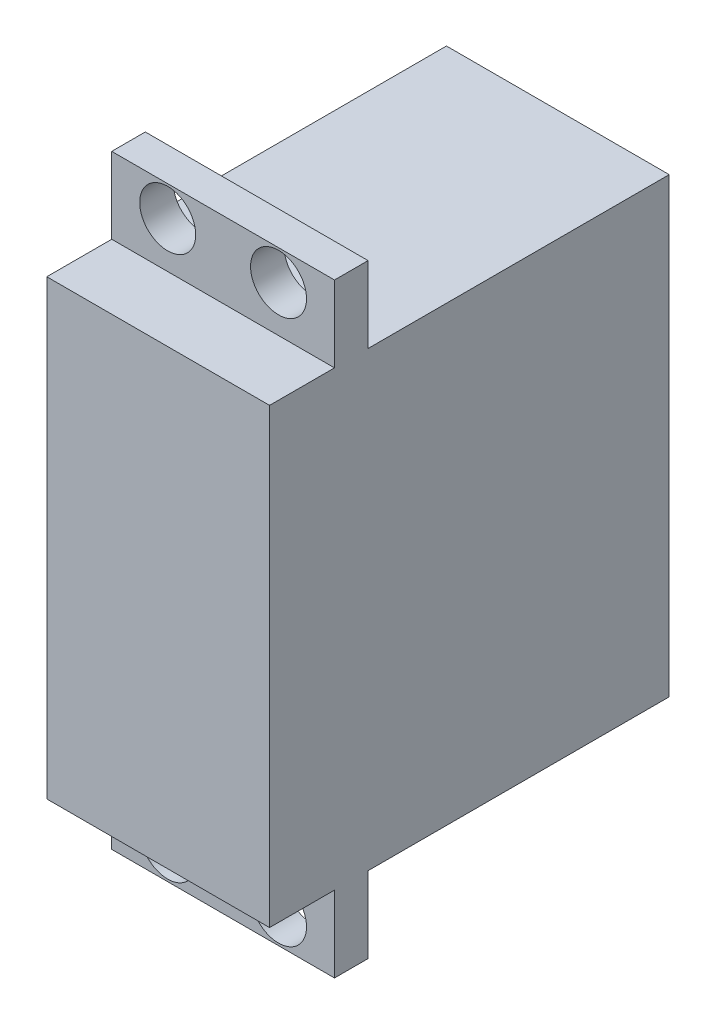
ISO-10303-21;
HEADER;
FILE_DESCRIPTION(('STEP AP214'),'2;1');
FILE_NAME('part.step','',(''),(''),'','','');
FILE_SCHEMA(('AUTOMOTIVE_DESIGN { 1 0 10303 214 1 1 1 1 }'));
ENDSEC;
DATA;
#1=APPLICATION_CONTEXT('core data for automotive mechanical design processes');
#2=APPLICATION_PROTOCOL_DEFINITION('international standard','automotive_design',2000,#1);
#3=PRODUCT_CONTEXT('',#1,'mechanical');
#4=PRODUCT('Part','Part','',(#3));
#5=PRODUCT_RELATED_PRODUCT_CATEGORY('part','',(#4));
#6=PRODUCT_DEFINITION_FORMATION('','',#4);
#7=PRODUCT_DEFINITION_CONTEXT('part definition',#1,'design');
#8=PRODUCT_DEFINITION('design','',#6,#7);
#9=PRODUCT_DEFINITION_SHAPE('','',#8);
#10=(LENGTH_UNIT() NAMED_UNIT(*) SI_UNIT(.MILLI.,.METRE.));
#11=(NAMED_UNIT(*) PLANE_ANGLE_UNIT() SI_UNIT($,.RADIAN.));
#12=(NAMED_UNIT(*) SI_UNIT($,.STERADIAN.) SOLID_ANGLE_UNIT());
#13=UNCERTAINTY_MEASURE_WITH_UNIT(LENGTH_MEASURE(1.E-05),#10,'distance_accuracy_value','');
#14=(GEOMETRIC_REPRESENTATION_CONTEXT(3) GLOBAL_UNCERTAINTY_ASSIGNED_CONTEXT((#13)) GLOBAL_UNIT_ASSIGNED_CONTEXT((#10,
#11,#12)) REPRESENTATION_CONTEXT('',''));
#15=CARTESIAN_POINT('',(0.,0.,0.));
#16=DIRECTION('',(0.,0.,1.));
#17=DIRECTION('',(1.,0.,0.));
#18=AXIS2_PLACEMENT_3D('',#15,#16,#17);
#19=CARTESIAN_POINT('',(-9.95,20.2,17.85));
#20=DIRECTION('',(0.,-1.,0.));
#21=DIRECTION('',(0.,0.,-1.));
#22=AXIS2_PLACEMENT_3D('',#19,#20,#21);
#23=PLANE('',#22);
#24=DIRECTION('',(1.,0.,0.));
#25=VECTOR('',#24,1.);
#26=CARTESIAN_POINT('',(-9.95,20.2,12.05));
#27=LINE('',#26,#25);
#28=CARTESIAN_POINT('',(-9.95,20.2,12.05));
#29=VERTEX_POINT('',#28);
#30=CARTESIAN_POINT('',(9.95,20.2,12.05));
#31=VERTEX_POINT('',#30);
#32=EDGE_CURVE('E178',#29,#31,#27,.T.);
#33=ORIENTED_EDGE('',*,*,#32,.F.);
#34=DIRECTION('',(0.,0.,-1.));
#35=VECTOR('',#34,1.);
#36=CARTESIAN_POINT('',(-9.95,20.2,17.85));
#37=LINE('',#36,#35);
#38=CARTESIAN_POINT('',(-9.95,20.2,17.85));
#39=VERTEX_POINT('',#38);
#40=EDGE_CURVE('E208',#39,#29,#37,.T.);
#41=ORIENTED_EDGE('',*,*,#40,.F.);
#42=DIRECTION('',(-1.,0.,0.));
#43=VECTOR('',#42,1.);
#44=CARTESIAN_POINT('',(-9.95,20.2,17.85));
#45=LINE('',#44,#43);
#46=CARTESIAN_POINT('',(9.95,20.2,17.85));
#47=VERTEX_POINT('',#46);
#48=EDGE_CURVE('E184',#47,#39,#45,.T.);
#49=ORIENTED_EDGE('',*,*,#48,.F.);
#50=DIRECTION('',(0.,0.,-1.));
#51=VECTOR('',#50,1.);
#52=CARTESIAN_POINT('',(9.95,20.2,17.85));
#53=LINE('',#52,#51);
#54=EDGE_CURVE('E212',#47,#31,#53,.T.);
#55=ORIENTED_EDGE('',*,*,#54,.T.);
#56=EDGE_LOOP('',(#33,#41,#49,#55));
#57=FACE_BOUND('',#56,.T.);
#58=ADVANCED_FACE('F37',(#57),#23,.F.);
#59=CARTESIAN_POINT('',(-9.95,-20.2,17.85));
#60=DIRECTION('',(0.,1.,0.));
#61=DIRECTION('',(0.,0.,1.));
#62=AXIS2_PLACEMENT_3D('',#59,#60,#61);
#63=PLANE('',#62);
#64=DIRECTION('',(-1.,0.,0.));
#65=VECTOR('',#64,1.);
#66=CARTESIAN_POINT('',(-9.95,-20.2,12.05));
#67=LINE('',#66,#65);
#68=CARTESIAN_POINT('',(9.95,-20.2,12.05));
#69=VERTEX_POINT('',#68);
#70=CARTESIAN_POINT('',(-9.95,-20.2,12.05));
#71=VERTEX_POINT('',#70);
#72=EDGE_CURVE('E11',#69,#71,#67,.T.);
#73=ORIENTED_EDGE('',*,*,#72,.F.);
#74=DIRECTION('',(0.,0.,-1.));
#75=VECTOR('',#74,1.);
#76=CARTESIAN_POINT('',(9.95,-20.2,17.85));
#77=LINE('',#76,#75);
#78=CARTESIAN_POINT('',(9.95,-20.2,17.85));
#79=VERTEX_POINT('',#78);
#80=EDGE_CURVE('E137',#79,#69,#77,.T.);
#81=ORIENTED_EDGE('',*,*,#80,.F.);
#82=DIRECTION('',(1.,0.,0.));
#83=VECTOR('',#82,1.);
#84=CARTESIAN_POINT('',(-9.95,-20.2,17.85));
#85=LINE('',#84,#83);
#86=CARTESIAN_POINT('',(-9.95,-20.2,17.85));
#87=VERTEX_POINT('',#86);
#88=EDGE_CURVE('E189',#87,#79,#85,.T.);
#89=ORIENTED_EDGE('',*,*,#88,.F.);
#90=DIRECTION('',(0.,0.,-1.));
#91=VECTOR('',#90,1.);
#92=CARTESIAN_POINT('',(-9.95,-20.2,17.85));
#93=LINE('',#92,#91);
#94=EDGE_CURVE('E204',#87,#71,#93,.T.);
#95=ORIENTED_EDGE('',*,*,#94,.T.);
#96=EDGE_LOOP('',(#73,#81,#89,#95));
#97=FACE_BOUND('',#96,.T.);
#98=ADVANCED_FACE('F284',(#97),#63,.F.);
#99=CARTESIAN_POINT('',(9.95,-20.2,17.85));
#100=DIRECTION('',(-1.,0.,0.));
#101=DIRECTION('',(0.,0.,1.));
#102=AXIS2_PLACEMENT_3D('',#99,#100,#101);
#103=PLANE('',#102);
#104=CARTESIAN_POINT('',(9.95,20.2,9.05));
#105=VERTEX_POINT('',#104);
#106=CARTESIAN_POINT('',(9.95,20.2,-17.85));
#107=VERTEX_POINT('',#106);
#108=EDGE_CURVE('E211',#105,#107,#53,.T.);
#109=ORIENTED_EDGE('',*,*,#108,.F.);
#110=DIRECTION('',(0.,-1.,0.));
#111=VECTOR('',#110,1.);
#112=CARTESIAN_POINT('',(9.95,-27.,9.05));
#113=LINE('',#112,#111);
#114=CARTESIAN_POINT('',(9.95,27.,9.05));
#115=VERTEX_POINT('',#114);
#116=EDGE_CURVE('E54',#115,#105,#113,.T.);
#117=ORIENTED_EDGE('',*,*,#116,.F.);
#118=DIRECTION('',(0.,0.,-1.));
#119=VECTOR('',#118,1.);
#120=CARTESIAN_POINT('',(9.95,27.,12.05));
#121=LINE('',#120,#119);
#122=CARTESIAN_POINT('',(9.95,27.,12.05));
#123=VERTEX_POINT('',#122);
#124=EDGE_CURVE('E170',#123,#115,#121,.T.);
#125=ORIENTED_EDGE('',*,*,#124,.F.);
#126=DIRECTION('',(0.,-1.,0.));
#127=VECTOR('',#126,1.);
#128=CARTESIAN_POINT('',(9.95,-27.,12.05));
#129=LINE('',#128,#127);
#130=EDGE_CURVE('E141',#123,#31,#129,.T.);
#131=ORIENTED_EDGE('',*,*,#130,.T.);
#132=ORIENTED_EDGE('',*,*,#54,.F.);
#133=DIRECTION('',(0.,1.,0.));
#134=VECTOR('',#133,1.);
#135=CARTESIAN_POINT('',(9.95,-20.2,17.85));
#136=LINE('',#135,#134);
#137=EDGE_CURVE('E181',#79,#47,#136,.T.);
#138=ORIENTED_EDGE('',*,*,#137,.F.);
#139=ORIENTED_EDGE('',*,*,#80,.T.);
#140=CARTESIAN_POINT('',(9.95,-27.,12.05));
#141=VERTEX_POINT('',#140);
#142=EDGE_CURVE('E129',#69,#141,#129,.T.);
#143=ORIENTED_EDGE('',*,*,#142,.T.);
#144=DIRECTION('',(0.,0.,-1.));
#145=VECTOR('',#144,1.);
#146=CARTESIAN_POINT('',(9.95,-27.,12.05));
#147=LINE('',#146,#145);
#148=CARTESIAN_POINT('',(9.95,-27.,9.05));
#149=VERTEX_POINT('',#148);
#150=EDGE_CURVE('E133',#141,#149,#147,.T.);
#151=ORIENTED_EDGE('',*,*,#150,.T.);
#152=CARTESIAN_POINT('',(9.95,-20.2,9.05));
#153=VERTEX_POINT('',#152);
#154=EDGE_CURVE('E165',#153,#149,#113,.T.);
#155=ORIENTED_EDGE('',*,*,#154,.F.);
#156=CARTESIAN_POINT('',(9.95,-20.2,-17.85));
#157=VERTEX_POINT('',#156);
#158=EDGE_CURVE('E191',#153,#157,#77,.T.);
#159=ORIENTED_EDGE('',*,*,#158,.T.);
#160=DIRECTION('',(0.,1.,0.));
#161=VECTOR('',#160,1.);
#162=CARTESIAN_POINT('',(9.95,-20.2,-17.85));
#163=LINE('',#162,#161);
#164=EDGE_CURVE('E180',#157,#107,#163,.T.);
#165=ORIENTED_EDGE('',*,*,#164,.T.);
#166=EDGE_LOOP('',(#109,#117,#125,#131,#132,#138,#139,#143,#151,#155,#159,#165));
#167=FACE_BOUND('',#166,.T.);
#168=ADVANCED_FACE('F39',(#167),#103,.F.);
#169=CARTESIAN_POINT('',(-9.95,20.2,9.05));
#170=VERTEX_POINT('',#169);
#171=CARTESIAN_POINT('',(-9.95,20.2,-17.85));
#172=VERTEX_POINT('',#171);
#173=EDGE_CURVE('E207',#170,#172,#37,.T.);
#174=ORIENTED_EDGE('',*,*,#173,.F.);
#175=DIRECTION('',(1.,0.,0.));
#176=VECTOR('',#175,1.);
#177=CARTESIAN_POINT('',(-9.95,20.2,9.05));
#178=LINE('',#177,#176);
#179=EDGE_CURVE('E172',#170,#105,#178,.T.);
#180=ORIENTED_EDGE('',*,*,#179,.T.);
#181=ORIENTED_EDGE('',*,*,#108,.T.);
#182=DIRECTION('',(-1.,0.,0.));
#183=VECTOR('',#182,1.);
#184=CARTESIAN_POINT('',(-9.95,20.2,-17.85));
#185=LINE('',#184,#183);
#186=EDGE_CURVE('E194',#107,#172,#185,.T.);
#187=ORIENTED_EDGE('',*,*,#186,.T.);
#188=EDGE_LOOP('',(#174,#180,#181,#187));
#189=FACE_BOUND('',#188,.T.);
#190=ADVANCED_FACE('F263',(#189),#23,.F.);
#191=CARTESIAN_POINT('',(-9.95,-20.2,17.85));
#192=DIRECTION('',(1.,0.,0.));
#193=DIRECTION('',(0.,0.,-1.));
#194=AXIS2_PLACEMENT_3D('',#191,#192,#193);
#195=PLANE('',#194);
#196=CARTESIAN_POINT('',(-9.95,-20.2,9.05));
#197=VERTEX_POINT('',#196);
#198=CARTESIAN_POINT('',(-9.95,-20.2,-17.85));
#199=VERTEX_POINT('',#198);
#200=EDGE_CURVE('E203',#197,#199,#93,.T.);
#201=ORIENTED_EDGE('',*,*,#200,.F.);
#202=DIRECTION('',(0.,1.,0.));
#203=VECTOR('',#202,1.);
#204=CARTESIAN_POINT('',(-9.95,-27.,9.05));
#205=LINE('',#204,#203);
#206=CARTESIAN_POINT('',(-9.95,-27.,9.05));
#207=VERTEX_POINT('',#206);
#208=EDGE_CURVE('E62',#207,#197,#205,.T.);
#209=ORIENTED_EDGE('',*,*,#208,.F.);
#210=DIRECTION('',(0.,0.,-1.));
#211=VECTOR('',#210,1.);
#212=CARTESIAN_POINT('',(-9.95,-27.,12.05));
#213=LINE('',#212,#211);
#214=CARTESIAN_POINT('',(-9.95,-27.,12.05));
#215=VERTEX_POINT('',#214);
#216=EDGE_CURVE('E149',#215,#207,#213,.T.);
#217=ORIENTED_EDGE('',*,*,#216,.F.);
#218=DIRECTION('',(0.,1.,0.));
#219=VECTOR('',#218,1.);
#220=CARTESIAN_POINT('',(-9.95,-27.,12.05));
#221=LINE('',#220,#219);
#222=EDGE_CURVE('E155',#215,#71,#221,.T.);
#223=ORIENTED_EDGE('',*,*,#222,.T.);
#224=ORIENTED_EDGE('',*,*,#94,.F.);
#225=DIRECTION('',(0.,-1.,0.));
#226=VECTOR('',#225,1.);
#227=CARTESIAN_POINT('',(-9.95,-20.2,17.85));
#228=LINE('',#227,#226);
#229=EDGE_CURVE('E187',#39,#87,#228,.T.);
#230=ORIENTED_EDGE('',*,*,#229,.F.);
#231=ORIENTED_EDGE('',*,*,#40,.T.);
#232=CARTESIAN_POINT('',(-9.95,27.,12.05));
#233=VERTEX_POINT('',#232);
#234=EDGE_CURVE('E156',#29,#233,#221,.T.);
#235=ORIENTED_EDGE('',*,*,#234,.T.);
#236=DIRECTION('',(0.,0.,-1.));
#237=VECTOR('',#236,1.);
#238=CARTESIAN_POINT('',(-9.95,27.,12.05));
#239=LINE('',#238,#237);
#240=CARTESIAN_POINT('',(-9.95,27.,9.05));
#241=VERTEX_POINT('',#240);
#242=EDGE_CURVE('E173',#233,#241,#239,.T.);
#243=ORIENTED_EDGE('',*,*,#242,.T.);
#244=EDGE_CURVE('E167',#170,#241,#205,.T.);
#245=ORIENTED_EDGE('',*,*,#244,.F.);
#246=ORIENTED_EDGE('',*,*,#173,.T.);
#247=DIRECTION('',(0.,-1.,0.));
#248=VECTOR('',#247,1.);
#249=CARTESIAN_POINT('',(-9.95,-20.2,-17.85));
#250=LINE('',#249,#248);
#251=EDGE_CURVE('E197',#172,#199,#250,.T.);
#252=ORIENTED_EDGE('',*,*,#251,.T.);
#253=EDGE_LOOP('',(#201,#209,#217,#223,#224,#230,#231,#235,#243,#245,#246,#252));
#254=FACE_BOUND('',#253,.T.);
#255=ADVANCED_FACE('F266',(#254),#195,.F.);
#256=ORIENTED_EDGE('',*,*,#158,.F.);
#257=DIRECTION('',(-1.,0.,0.));
#258=VECTOR('',#257,1.);
#259=CARTESIAN_POINT('',(-9.95,-20.2,9.05));
#260=LINE('',#259,#258);
#261=EDGE_CURVE('E46',#153,#197,#260,.T.);
#262=ORIENTED_EDGE('',*,*,#261,.T.);
#263=ORIENTED_EDGE('',*,*,#200,.T.);
#264=DIRECTION('',(1.,0.,0.));
#265=VECTOR('',#264,1.);
#266=CARTESIAN_POINT('',(-9.95,-20.2,-17.85));
#267=LINE('',#266,#265);
#268=EDGE_CURVE('E185',#199,#157,#267,.T.);
#269=ORIENTED_EDGE('',*,*,#268,.T.);
#270=EDGE_LOOP('',(#256,#262,#263,#269));
#271=FACE_BOUND('',#270,.T.);
#272=ADVANCED_FACE('F254',(#271),#63,.F.);
#273=CARTESIAN_POINT('',(0.,0.,17.85));
#274=DIRECTION('',(0.,0.,-1.));
#275=DIRECTION('',(-1.,0.,0.));
#276=AXIS2_PLACEMENT_3D('',#273,#274,#275);
#277=PLANE('',#276);
#278=ORIENTED_EDGE('',*,*,#137,.T.);
#279=ORIENTED_EDGE('',*,*,#48,.T.);
#280=ORIENTED_EDGE('',*,*,#229,.T.);
#281=ORIENTED_EDGE('',*,*,#88,.T.);
#282=EDGE_LOOP('',(#278,#279,#280,#281));
#283=FACE_BOUND('',#282,.T.);
#284=ADVANCED_FACE('F282',(#283),#277,.F.);
#285=CARTESIAN_POINT('',(0.,0.,-17.85));
#286=DIRECTION('',(0.,0.,-1.));
#287=DIRECTION('',(-1.,0.,0.));
#288=AXIS2_PLACEMENT_3D('',#285,#286,#287);
#289=PLANE('',#288);
#290=ORIENTED_EDGE('',*,*,#164,.F.);
#291=ORIENTED_EDGE('',*,*,#268,.F.);
#292=ORIENTED_EDGE('',*,*,#251,.F.);
#293=ORIENTED_EDGE('',*,*,#186,.F.);
#294=EDGE_LOOP('',(#290,#291,#292,#293));
#295=FACE_BOUND('',#294,.T.);
#296=ADVANCED_FACE('F260',(#295),#289,.T.);
#297=CARTESIAN_POINT('',(-9.95,-27.,12.05));
#298=DIRECTION('',(0.,-1.,0.));
#299=DIRECTION('',(1.,0.,0.));
#300=AXIS2_PLACEMENT_3D('',#297,#298,#299);
#301=PLANE('',#300);
#302=DIRECTION('',(-1.,0.,0.));
#303=VECTOR('',#302,1.);
#304=CARTESIAN_POINT('',(-9.95,-27.,9.05));
#305=LINE('',#304,#303);
#306=EDGE_CURVE('E148',#149,#207,#305,.T.);
#307=ORIENTED_EDGE('',*,*,#306,.F.);
#308=ORIENTED_EDGE('',*,*,#150,.F.);
#309=DIRECTION('',(-1.,0.,0.));
#310=VECTOR('',#309,1.);
#311=CARTESIAN_POINT('',(-9.95,-27.,12.05));
#312=LINE('',#311,#310);
#313=EDGE_CURVE('E147',#141,#215,#312,.T.);
#314=ORIENTED_EDGE('',*,*,#313,.T.);
#315=ORIENTED_EDGE('',*,*,#216,.T.);
#316=EDGE_LOOP('',(#307,#308,#314,#315));
#317=FACE_BOUND('',#316,.T.);
#318=ADVANCED_FACE('F146',(#317),#301,.T.);
#319=CARTESIAN_POINT('',(0.,0.,12.05));
#320=DIRECTION('',(0.,0.,-1.));
#321=DIRECTION('',(-1.,0.,0.));
#322=AXIS2_PLACEMENT_3D('',#319,#320,#321);
#323=PLANE('',#322);
#324=CARTESIAN_POINT('',(-4.95,-24.3,12.05));
#325=DIRECTION('',(0.,0.,-1.));
#326=DIRECTION('',(-1.,0.,0.));
#327=AXIS2_PLACEMENT_3D('',#324,#325,#326);
#328=CIRCLE('',#327,2.5);
#329=CARTESIAN_POINT('',(-2.45,-24.3,12.05));
#330=VERTEX_POINT('',#329);
#331=EDGE_CURVE('E235',#330,#330,#328,.T.);
#332=ORIENTED_EDGE('',*,*,#331,.T.);
#333=EDGE_LOOP('',(#332));
#334=FACE_BOUND('',#333,.T.);
#335=CARTESIAN_POINT('',(4.95,-24.3,12.05));
#336=DIRECTION('',(0.,0.,-1.));
#337=DIRECTION('',(-1.,0.,0.));
#338=AXIS2_PLACEMENT_3D('',#335,#336,#337);
#339=CIRCLE('',#338,2.5);
#340=CARTESIAN_POINT('',(7.45,-24.3,12.05));
#341=VERTEX_POINT('',#340);
#342=EDGE_CURVE('E225',#341,#341,#339,.T.);
#343=ORIENTED_EDGE('',*,*,#342,.T.);
#344=EDGE_LOOP('',(#343));
#345=FACE_BOUND('',#344,.T.);
#346=ORIENTED_EDGE('',*,*,#142,.F.);
#347=ORIENTED_EDGE('',*,*,#72,.T.);
#348=ORIENTED_EDGE('',*,*,#222,.F.);
#349=ORIENTED_EDGE('',*,*,#313,.F.);
#350=EDGE_LOOP('',(#346,#347,#348,#349));
#351=FACE_BOUND('',#350,.T.);
#352=ADVANCED_FACE('F153',(#334,#345,#351),#323,.F.);
#353=CARTESIAN_POINT('',(0.,0.,9.05));
#354=DIRECTION('',(0.,0.,-1.));
#355=DIRECTION('',(-1.,0.,0.));
#356=AXIS2_PLACEMENT_3D('',#353,#354,#355);
#357=PLANE('',#356);
#358=CARTESIAN_POINT('',(-4.95,-24.3,9.05));
#359=DIRECTION('',(0.,0.,-1.));
#360=DIRECTION('',(-1.,0.,0.));
#361=AXIS2_PLACEMENT_3D('',#358,#359,#360);
#362=CIRCLE('',#361,2.5);
#363=CARTESIAN_POINT('',(-2.45,-24.3,9.05));
#364=VERTEX_POINT('',#363);
#365=EDGE_CURVE('E41',#364,#364,#362,.T.);
#366=ORIENTED_EDGE('',*,*,#365,.F.);
#367=EDGE_LOOP('',(#366));
#368=FACE_BOUND('',#367,.T.);
#369=CARTESIAN_POINT('',(4.95,-24.3,9.05));
#370=DIRECTION('',(0.,0.,-1.));
#371=DIRECTION('',(-1.,0.,0.));
#372=AXIS2_PLACEMENT_3D('',#369,#370,#371);
#373=CIRCLE('',#372,2.5);
#374=CARTESIAN_POINT('',(7.45,-24.3,9.05));
#375=VERTEX_POINT('',#374);
#376=EDGE_CURVE('E223',#375,#375,#373,.T.);
#377=ORIENTED_EDGE('',*,*,#376,.F.);
#378=EDGE_LOOP('',(#377));
#379=FACE_BOUND('',#378,.T.);
#380=ORIENTED_EDGE('',*,*,#261,.F.);
#381=ORIENTED_EDGE('',*,*,#154,.T.);
#382=ORIENTED_EDGE('',*,*,#306,.T.);
#383=ORIENTED_EDGE('',*,*,#208,.T.);
#384=EDGE_LOOP('',(#380,#381,#382,#383));
#385=FACE_BOUND('',#384,.T.);
#386=ADVANCED_FACE('F245',(#368,#379,#385),#357,.T.);
#387=CARTESIAN_POINT('',(4.95,24.3,12.05));
#388=DIRECTION('',(0.,0.,-1.));
#389=DIRECTION('',(-1.,0.,0.));
#390=AXIS2_PLACEMENT_3D('',#387,#388,#389);
#391=CIRCLE('',#390,2.5);
#392=CARTESIAN_POINT('',(7.45,24.3,12.05));
#393=VERTEX_POINT('',#392);
#394=EDGE_CURVE('E222',#393,#393,#391,.T.);
#395=ORIENTED_EDGE('',*,*,#394,.T.);
#396=EDGE_LOOP('',(#395));
#397=FACE_BOUND('',#396,.T.);
#398=CARTESIAN_POINT('',(-4.95,24.3,12.05));
#399=DIRECTION('',(0.,0.,-1.));
#400=DIRECTION('',(-1.,0.,0.));
#401=AXIS2_PLACEMENT_3D('',#398,#399,#400);
#402=CIRCLE('',#401,2.5);
#403=CARTESIAN_POINT('',(-2.45,24.3,12.05));
#404=VERTEX_POINT('',#403);
#405=EDGE_CURVE('E219',#404,#404,#402,.T.);
#406=ORIENTED_EDGE('',*,*,#405,.T.);
#407=EDGE_LOOP('',(#406));
#408=FACE_BOUND('',#407,.T.);
#409=ORIENTED_EDGE('',*,*,#234,.F.);
#410=ORIENTED_EDGE('',*,*,#32,.T.);
#411=ORIENTED_EDGE('',*,*,#130,.F.);
#412=DIRECTION('',(1.,0.,0.));
#413=VECTOR('',#412,1.);
#414=CARTESIAN_POINT('',(-9.95,27.,12.05));
#415=LINE('',#414,#413);
#416=EDGE_CURVE('E150',#233,#123,#415,.T.);
#417=ORIENTED_EDGE('',*,*,#416,.F.);
#418=EDGE_LOOP('',(#409,#410,#411,#417));
#419=FACE_BOUND('',#418,.T.);
#420=ADVANCED_FACE('F248',(#397,#408,#419),#323,.F.);
#421=CARTESIAN_POINT('',(4.95,24.3,9.05));
#422=DIRECTION('',(0.,0.,-1.));
#423=DIRECTION('',(-1.,0.,0.));
#424=AXIS2_PLACEMENT_3D('',#421,#422,#423);
#425=CIRCLE('',#424,2.5);
#426=CARTESIAN_POINT('',(7.45,24.3,9.05));
#427=VERTEX_POINT('',#426);
#428=EDGE_CURVE('E220',#427,#427,#425,.T.);
#429=ORIENTED_EDGE('',*,*,#428,.F.);
#430=EDGE_LOOP('',(#429));
#431=FACE_BOUND('',#430,.T.);
#432=CARTESIAN_POINT('',(-4.95,24.3,9.05));
#433=DIRECTION('',(0.,0.,-1.));
#434=DIRECTION('',(-1.,0.,0.));
#435=AXIS2_PLACEMENT_3D('',#432,#433,#434);
#436=CIRCLE('',#435,2.5);
#437=CARTESIAN_POINT('',(-2.45,24.3,9.05));
#438=VERTEX_POINT('',#437);
#439=EDGE_CURVE('E216',#438,#438,#436,.T.);
#440=ORIENTED_EDGE('',*,*,#439,.F.);
#441=EDGE_LOOP('',(#440));
#442=FACE_BOUND('',#441,.T.);
#443=ORIENTED_EDGE('',*,*,#179,.F.);
#444=ORIENTED_EDGE('',*,*,#244,.T.);
#445=DIRECTION('',(1.,0.,0.));
#446=VECTOR('',#445,1.);
#447=CARTESIAN_POINT('',(-9.95,27.,9.05));
#448=LINE('',#447,#446);
#449=EDGE_CURVE('E142',#241,#115,#448,.T.);
#450=ORIENTED_EDGE('',*,*,#449,.T.);
#451=ORIENTED_EDGE('',*,*,#116,.T.);
#452=EDGE_LOOP('',(#443,#444,#450,#451));
#453=FACE_BOUND('',#452,.T.);
#454=ADVANCED_FACE('F250',(#431,#442,#453),#357,.T.);
#455=CARTESIAN_POINT('',(-9.95,27.,12.05));
#456=DIRECTION('',(0.,1.,0.));
#457=DIRECTION('',(0.,0.,1.));
#458=AXIS2_PLACEMENT_3D('',#455,#456,#457);
#459=PLANE('',#458);
#460=ORIENTED_EDGE('',*,*,#449,.F.);
#461=ORIENTED_EDGE('',*,*,#242,.F.);
#462=ORIENTED_EDGE('',*,*,#416,.T.);
#463=ORIENTED_EDGE('',*,*,#124,.T.);
#464=EDGE_LOOP('',(#460,#461,#462,#463));
#465=FACE_BOUND('',#464,.T.);
#466=ADVANCED_FACE('F271',(#465),#459,.T.);
#467=CARTESIAN_POINT('',(-4.95,24.3,-17.85));
#468=DIRECTION('',(0.,0.,1.));
#469=DIRECTION('',(1.,0.,0.));
#470=AXIS2_PLACEMENT_3D('',#467,#468,#469);
#471=CYLINDRICAL_SURFACE('',#470,2.5);
#472=CARTESIAN_POINT('',(-2.45,24.3,9.05));
#473=CARTESIAN_POINT('',(-2.45,24.3,9.08125));
#474=CARTESIAN_POINT('',(-2.45,24.3,9.1125));
#475=CARTESIAN_POINT('',(-2.45,24.3,9.175));
#476=CARTESIAN_POINT('',(-2.45,24.3,9.20625));
#477=CARTESIAN_POINT('',(-2.45,24.3,9.26875));
#478=CARTESIAN_POINT('',(-2.45,24.3,9.3));
#479=CARTESIAN_POINT('',(-2.45,24.3,9.3625));
#480=CARTESIAN_POINT('',(-2.45,24.3,9.39375));
#481=CARTESIAN_POINT('',(-2.45,24.3,9.45625));
#482=CARTESIAN_POINT('',(-2.45,24.3,9.4875));
#483=CARTESIAN_POINT('',(-2.45,24.3,9.55));
#484=CARTESIAN_POINT('',(-2.45,24.3,9.58125));
#485=CARTESIAN_POINT('',(-2.45,24.3,9.64375));
#486=CARTESIAN_POINT('',(-2.45,24.3,9.675));
#487=CARTESIAN_POINT('',(-2.45,24.3,9.7375));
#488=CARTESIAN_POINT('',(-2.45,24.3,9.76875));
#489=CARTESIAN_POINT('',(-2.45,24.3,9.83125));
#490=CARTESIAN_POINT('',(-2.45,24.3,9.8625));
#491=CARTESIAN_POINT('',(-2.45,24.3,9.925));
#492=CARTESIAN_POINT('',(-2.45,24.3,9.95625));
#493=CARTESIAN_POINT('',(-2.45,24.3,10.01875));
#494=CARTESIAN_POINT('',(-2.45,24.3,10.05));
#495=CARTESIAN_POINT('',(-2.45,24.3,10.1125));
#496=CARTESIAN_POINT('',(-2.45,24.3,10.14375));
#497=CARTESIAN_POINT('',(-2.45,24.3,10.20625));
#498=CARTESIAN_POINT('',(-2.45,24.3,10.2375));
#499=CARTESIAN_POINT('',(-2.45,24.3,10.3));
#500=CARTESIAN_POINT('',(-2.45,24.3,10.33125));
#501=CARTESIAN_POINT('',(-2.45,24.3,10.39375));
#502=CARTESIAN_POINT('',(-2.45,24.3,10.425));
#503=CARTESIAN_POINT('',(-2.45,24.3,10.4875));
#504=CARTESIAN_POINT('',(-2.45,24.3,10.51875));
#505=CARTESIAN_POINT('',(-2.45,24.3,10.58125));
#506=CARTESIAN_POINT('',(-2.45,24.3,10.6125));
#507=CARTESIAN_POINT('',(-2.45,24.3,10.675));
#508=CARTESIAN_POINT('',(-2.45,24.3,10.70625));
#509=CARTESIAN_POINT('',(-2.45,24.3,10.76875));
#510=CARTESIAN_POINT('',(-2.45,24.3,10.8));
#511=CARTESIAN_POINT('',(-2.45,24.3,10.8625));
#512=CARTESIAN_POINT('',(-2.45,24.3,10.89375));
#513=CARTESIAN_POINT('',(-2.45,24.3,10.95625));
#514=CARTESIAN_POINT('',(-2.45,24.3,10.9875));
#515=CARTESIAN_POINT('',(-2.45,24.3,11.05));
#516=CARTESIAN_POINT('',(-2.45,24.3,11.08125));
#517=CARTESIAN_POINT('',(-2.45,24.3,11.14375));
#518=CARTESIAN_POINT('',(-2.45,24.3,11.175));
#519=CARTESIAN_POINT('',(-2.45,24.3,11.2375));
#520=CARTESIAN_POINT('',(-2.45,24.3,11.26875));
#521=CARTESIAN_POINT('',(-2.45,24.3,11.33125));
#522=CARTESIAN_POINT('',(-2.45,24.3,11.3625));
#523=CARTESIAN_POINT('',(-2.45,24.3,11.425));
#524=CARTESIAN_POINT('',(-2.45,24.3,11.45625));
#525=CARTESIAN_POINT('',(-2.45,24.3,11.51875));
#526=CARTESIAN_POINT('',(-2.45,24.3,11.55));
#527=CARTESIAN_POINT('',(-2.45,24.3,11.6125));
#528=CARTESIAN_POINT('',(-2.45,24.3,11.64375));
#529=CARTESIAN_POINT('',(-2.45,24.3,11.70625));
#530=CARTESIAN_POINT('',(-2.45,24.3,11.7375));
#531=CARTESIAN_POINT('',(-2.45,24.3,11.8));
#532=CARTESIAN_POINT('',(-2.45,24.3,11.83125));
#533=CARTESIAN_POINT('',(-2.45,24.3,11.89375));
#534=CARTESIAN_POINT('',(-2.45,24.3,11.925));
#535=CARTESIAN_POINT('',(-2.45,24.3,11.9875));
#536=CARTESIAN_POINT('',(-2.45,24.3,12.01875));
#537=CARTESIAN_POINT('',(-2.45,24.3,12.05));
#538=B_SPLINE_CURVE_WITH_KNOTS('',3,(#472,#473,#474,#475,#476,#477,#478,#479,#480,#481,#482,
#483,#484,#485,#486,#487,#488,#489,#490,#491,#492,#493,#494,#495,#496,#497,#498,#499,#500,#501,
#502,#503,#504,#505,#506,#507,#508,#509,#510,#511,#512,#513,#514,#515,#516,#517,#518,#519,#520,
#521,#522,#523,#524,#525,#526,#527,#528,#529,#530,#531,#532,#533,#534,#535,#536,#537),
.UNSPECIFIED.,.F.,.F.,(4,2,2,2,2,2,2,2,2,2,2,2,2,2,2,2,2,2,2,2,2,2,2,2,2,2,2,2,2,2,2,2,4),(0.,
0.0937500000000001,0.1875,0.28125,0.375,0.46875,0.5625,0.656250000000001,0.750000000000001,
0.843749999999997,0.937499999999997,1.03125,1.125,1.21875,1.3125,1.40625,1.5,1.59375,1.6875,
1.78125,1.875,1.96875,2.0625,2.15625,2.25,2.34375,2.4375,2.53125,2.625,2.71875,2.8125,2.90625,
3.),.UNSPECIFIED.);
#539=EDGE_CURVE('BSEAM390',#438,#404,#538,.T.);
#540=ORIENTED_EDGE('',*,*,#439,.T.);
#541=ORIENTED_EDGE('',*,*,#405,.F.);
#542=ORIENTED_EDGE('',*,*,#539,.T.);
#543=ORIENTED_EDGE('',*,*,#539,.F.);
#544=EDGE_LOOP('',(#540,#542,#541,#543));
#545=FACE_BOUND('',#544,.T.);
#546=ADVANCED_FACE('F390',(#545),#471,.F.);
#547=CARTESIAN_POINT('',(4.95,24.3,-17.85));
#548=DIRECTION('',(0.,0.,1.));
#549=DIRECTION('',(1.,0.,0.));
#550=AXIS2_PLACEMENT_3D('',#547,#548,#549);
#551=CYLINDRICAL_SURFACE('',#550,2.5);
#552=CARTESIAN_POINT('',(7.45,24.3,9.05));
#553=CARTESIAN_POINT('',(7.45,24.3,9.08125));
#554=CARTESIAN_POINT('',(7.45,24.3,9.1125));
#555=CARTESIAN_POINT('',(7.45,24.3,9.175));
#556=CARTESIAN_POINT('',(7.45,24.3,9.20625));
#557=CARTESIAN_POINT('',(7.45,24.3,9.26875));
#558=CARTESIAN_POINT('',(7.45,24.3,9.3));
#559=CARTESIAN_POINT('',(7.45,24.3,9.3625));
#560=CARTESIAN_POINT('',(7.45,24.3,9.39375));
#561=CARTESIAN_POINT('',(7.45,24.3,9.45625));
#562=CARTESIAN_POINT('',(7.45,24.3,9.4875));
#563=CARTESIAN_POINT('',(7.45,24.3,9.55));
#564=CARTESIAN_POINT('',(7.45,24.3,9.58125));
#565=CARTESIAN_POINT('',(7.45,24.3,9.64375));
#566=CARTESIAN_POINT('',(7.45,24.3,9.675));
#567=CARTESIAN_POINT('',(7.45,24.3,9.7375));
#568=CARTESIAN_POINT('',(7.45,24.3,9.76875));
#569=CARTESIAN_POINT('',(7.45,24.3,9.83125));
#570=CARTESIAN_POINT('',(7.45,24.3,9.8625));
#571=CARTESIAN_POINT('',(7.45,24.3,9.925));
#572=CARTESIAN_POINT('',(7.45,24.3,9.95625));
#573=CARTESIAN_POINT('',(7.45,24.3,10.01875));
#574=CARTESIAN_POINT('',(7.45,24.3,10.05));
#575=CARTESIAN_POINT('',(7.45,24.3,10.1125));
#576=CARTESIAN_POINT('',(7.45,24.3,10.14375));
#577=CARTESIAN_POINT('',(7.45,24.3,10.20625));
#578=CARTESIAN_POINT('',(7.45,24.3,10.2375));
#579=CARTESIAN_POINT('',(7.45,24.3,10.3));
#580=CARTESIAN_POINT('',(7.45,24.3,10.33125));
#581=CARTESIAN_POINT('',(7.45,24.3,10.39375));
#582=CARTESIAN_POINT('',(7.45,24.3,10.425));
#583=CARTESIAN_POINT('',(7.45,24.3,10.4875));
#584=CARTESIAN_POINT('',(7.45,24.3,10.51875));
#585=CARTESIAN_POINT('',(7.45,24.3,10.58125));
#586=CARTESIAN_POINT('',(7.45,24.3,10.6125));
#587=CARTESIAN_POINT('',(7.45,24.3,10.675));
#588=CARTESIAN_POINT('',(7.45,24.3,10.70625));
#589=CARTESIAN_POINT('',(7.45,24.3,10.76875));
#590=CARTESIAN_POINT('',(7.45,24.3,10.8));
#591=CARTESIAN_POINT('',(7.45,24.3,10.8625));
#592=CARTESIAN_POINT('',(7.45,24.3,10.89375));
#593=CARTESIAN_POINT('',(7.45,24.3,10.95625));
#594=CARTESIAN_POINT('',(7.45,24.3,10.9875));
#595=CARTESIAN_POINT('',(7.45,24.3,11.05));
#596=CARTESIAN_POINT('',(7.45,24.3,11.08125));
#597=CARTESIAN_POINT('',(7.45,24.3,11.14375));
#598=CARTESIAN_POINT('',(7.45,24.3,11.175));
#599=CARTESIAN_POINT('',(7.45,24.3,11.2375));
#600=CARTESIAN_POINT('',(7.45,24.3,11.26875));
#601=CARTESIAN_POINT('',(7.45,24.3,11.33125));
#602=CARTESIAN_POINT('',(7.45,24.3,11.3625));
#603=CARTESIAN_POINT('',(7.45,24.3,11.425));
#604=CARTESIAN_POINT('',(7.45,24.3,11.45625));
#605=CARTESIAN_POINT('',(7.45,24.3,11.51875));
#606=CARTESIAN_POINT('',(7.45,24.3,11.55));
#607=CARTESIAN_POINT('',(7.45,24.3,11.6125));
#608=CARTESIAN_POINT('',(7.45,24.3,11.64375));
#609=CARTESIAN_POINT('',(7.45,24.3,11.70625));
#610=CARTESIAN_POINT('',(7.45,24.3,11.7375));
#611=CARTESIAN_POINT('',(7.45,24.3,11.8));
#612=CARTESIAN_POINT('',(7.45,24.3,11.83125));
#613=CARTESIAN_POINT('',(7.45,24.3,11.89375));
#614=CARTESIAN_POINT('',(7.45,24.3,11.925));
#615=CARTESIAN_POINT('',(7.45,24.3,11.9875));
#616=CARTESIAN_POINT('',(7.45,24.3,12.01875));
#617=CARTESIAN_POINT('',(7.45,24.3,12.05));
#618=B_SPLINE_CURVE_WITH_KNOTS('',3,(#552,#553,#554,#555,#556,#557,#558,#559,#560,#561,#562,
#563,#564,#565,#566,#567,#568,#569,#570,#571,#572,#573,#574,#575,#576,#577,#578,#579,#580,#581,
#582,#583,#584,#585,#586,#587,#588,#589,#590,#591,#592,#593,#594,#595,#596,#597,#598,#599,#600,
#601,#602,#603,#604,#605,#606,#607,#608,#609,#610,#611,#612,#613,#614,#615,#616,#617),
.UNSPECIFIED.,.F.,.F.,(4,2,2,2,2,2,2,2,2,2,2,2,2,2,2,2,2,2,2,2,2,2,2,2,2,2,2,2,2,2,2,2,4),(0.,
0.0937500000000001,0.1875,0.28125,0.375,0.46875,0.5625,0.656250000000001,0.750000000000001,
0.843749999999997,0.937499999999997,1.03125,1.125,1.21875,1.3125,1.40625,1.5,1.59375,1.6875,
1.78125,1.875,1.96875,2.0625,2.15625,2.25,2.34375,2.4375,2.53125,2.625,2.71875,2.8125,2.90625,
3.),.UNSPECIFIED.);
#619=EDGE_CURVE('BSEAM397',#427,#393,#618,.T.);
#620=ORIENTED_EDGE('',*,*,#428,.T.);
#621=ORIENTED_EDGE('',*,*,#394,.F.);
#622=ORIENTED_EDGE('',*,*,#619,.T.);
#623=ORIENTED_EDGE('',*,*,#619,.F.);
#624=EDGE_LOOP('',(#620,#622,#621,#623));
#625=FACE_BOUND('',#624,.T.);
#626=ADVANCED_FACE('F397',(#625),#551,.F.);
#627=CARTESIAN_POINT('',(4.95,-24.3,-17.85));
#628=DIRECTION('',(0.,0.,1.));
#629=DIRECTION('',(1.,0.,0.));
#630=AXIS2_PLACEMENT_3D('',#627,#628,#629);
#631=CYLINDRICAL_SURFACE('',#630,2.5);
#632=CARTESIAN_POINT('',(7.45,-24.3,9.05));
#633=CARTESIAN_POINT('',(7.45,-24.3,9.08125));
#634=CARTESIAN_POINT('',(7.45,-24.3,9.1125));
#635=CARTESIAN_POINT('',(7.45,-24.3,9.175));
#636=CARTESIAN_POINT('',(7.45,-24.3,9.20625));
#637=CARTESIAN_POINT('',(7.45,-24.3,9.26875));
#638=CARTESIAN_POINT('',(7.45,-24.3,9.3));
#639=CARTESIAN_POINT('',(7.45,-24.3,9.3625));
#640=CARTESIAN_POINT('',(7.45,-24.3,9.39375));
#641=CARTESIAN_POINT('',(7.45,-24.3,9.45625));
#642=CARTESIAN_POINT('',(7.45,-24.3,9.4875));
#643=CARTESIAN_POINT('',(7.45,-24.3,9.55));
#644=CARTESIAN_POINT('',(7.45,-24.3,9.58125));
#645=CARTESIAN_POINT('',(7.45,-24.3,9.64375));
#646=CARTESIAN_POINT('',(7.45,-24.3,9.675));
#647=CARTESIAN_POINT('',(7.45,-24.3,9.7375));
#648=CARTESIAN_POINT('',(7.45,-24.3,9.76875));
#649=CARTESIAN_POINT('',(7.45,-24.3,9.83125));
#650=CARTESIAN_POINT('',(7.45,-24.3,9.8625));
#651=CARTESIAN_POINT('',(7.45,-24.3,9.925));
#652=CARTESIAN_POINT('',(7.45,-24.3,9.95625));
#653=CARTESIAN_POINT('',(7.45,-24.3,10.01875));
#654=CARTESIAN_POINT('',(7.45,-24.3,10.05));
#655=CARTESIAN_POINT('',(7.45,-24.3,10.1125));
#656=CARTESIAN_POINT('',(7.45,-24.3,10.14375));
#657=CARTESIAN_POINT('',(7.45,-24.3,10.20625));
#658=CARTESIAN_POINT('',(7.45,-24.3,10.2375));
#659=CARTESIAN_POINT('',(7.45,-24.3,10.3));
#660=CARTESIAN_POINT('',(7.45,-24.3,10.33125));
#661=CARTESIAN_POINT('',(7.45,-24.3,10.39375));
#662=CARTESIAN_POINT('',(7.45,-24.3,10.425));
#663=CARTESIAN_POINT('',(7.45,-24.3,10.4875));
#664=CARTESIAN_POINT('',(7.45,-24.3,10.51875));
#665=CARTESIAN_POINT('',(7.45,-24.3,10.58125));
#666=CARTESIAN_POINT('',(7.45,-24.3,10.6125));
#667=CARTESIAN_POINT('',(7.45,-24.3,10.675));
#668=CARTESIAN_POINT('',(7.45,-24.3,10.70625));
#669=CARTESIAN_POINT('',(7.45,-24.3,10.76875));
#670=CARTESIAN_POINT('',(7.45,-24.3,10.8));
#671=CARTESIAN_POINT('',(7.45,-24.3,10.8625));
#672=CARTESIAN_POINT('',(7.45,-24.3,10.89375));
#673=CARTESIAN_POINT('',(7.45,-24.3,10.95625));
#674=CARTESIAN_POINT('',(7.45,-24.3,10.9875));
#675=CARTESIAN_POINT('',(7.45,-24.3,11.05));
#676=CARTESIAN_POINT('',(7.45,-24.3,11.08125));
#677=CARTESIAN_POINT('',(7.45,-24.3,11.14375));
#678=CARTESIAN_POINT('',(7.45,-24.3,11.175));
#679=CARTESIAN_POINT('',(7.45,-24.3,11.2375));
#680=CARTESIAN_POINT('',(7.45,-24.3,11.26875));
#681=CARTESIAN_POINT('',(7.45,-24.3,11.33125));
#682=CARTESIAN_POINT('',(7.45,-24.3,11.3625));
#683=CARTESIAN_POINT('',(7.45,-24.3,11.425));
#684=CARTESIAN_POINT('',(7.45,-24.3,11.45625));
#685=CARTESIAN_POINT('',(7.45,-24.3,11.51875));
#686=CARTESIAN_POINT('',(7.45,-24.3,11.55));
#687=CARTESIAN_POINT('',(7.45,-24.3,11.6125));
#688=CARTESIAN_POINT('',(7.45,-24.3,11.64375));
#689=CARTESIAN_POINT('',(7.45,-24.3,11.70625));
#690=CARTESIAN_POINT('',(7.45,-24.3,11.7375));
#691=CARTESIAN_POINT('',(7.45,-24.3,11.8));
#692=CARTESIAN_POINT('',(7.45,-24.3,11.83125));
#693=CARTESIAN_POINT('',(7.45,-24.3,11.89375));
#694=CARTESIAN_POINT('',(7.45,-24.3,11.925));
#695=CARTESIAN_POINT('',(7.45,-24.3,11.9875));
#696=CARTESIAN_POINT('',(7.45,-24.3,12.01875));
#697=CARTESIAN_POINT('',(7.45,-24.3,12.05));
#698=B_SPLINE_CURVE_WITH_KNOTS('',3,(#632,#633,#634,#635,#636,#637,#638,#639,#640,#641,#642,
#643,#644,#645,#646,#647,#648,#649,#650,#651,#652,#653,#654,#655,#656,#657,#658,#659,#660,#661,
#662,#663,#664,#665,#666,#667,#668,#669,#670,#671,#672,#673,#674,#675,#676,#677,#678,#679,#680,
#681,#682,#683,#684,#685,#686,#687,#688,#689,#690,#691,#692,#693,#694,#695,#696,#697),
.UNSPECIFIED.,.F.,.F.,(4,2,2,2,2,2,2,2,2,2,2,2,2,2,2,2,2,2,2,2,2,2,2,2,2,2,2,2,2,2,2,2,4),(0.,
0.0937500000000001,0.1875,0.28125,0.375,0.46875,0.5625,0.656250000000001,0.750000000000001,
0.843749999999997,0.937499999999997,1.03125,1.125,1.21875,1.3125,1.40625,1.5,1.59375,1.6875,
1.78125,1.875,1.96875,2.0625,2.15625,2.25,2.34375,2.4375,2.53125,2.625,2.71875,2.8125,2.90625,
3.),.UNSPECIFIED.);
#699=EDGE_CURVE('BSEAM406',#375,#341,#698,.T.);
#700=ORIENTED_EDGE('',*,*,#376,.T.);
#701=ORIENTED_EDGE('',*,*,#342,.F.);
#702=ORIENTED_EDGE('',*,*,#699,.T.);
#703=ORIENTED_EDGE('',*,*,#699,.F.);
#704=EDGE_LOOP('',(#700,#702,#701,#703));
#705=FACE_BOUND('',#704,.T.);
#706=ADVANCED_FACE('F406',(#705),#631,.F.);
#707=CARTESIAN_POINT('',(-4.95,-24.3,-17.85));
#708=DIRECTION('',(0.,0.,1.));
#709=DIRECTION('',(1.,0.,0.));
#710=AXIS2_PLACEMENT_3D('',#707,#708,#709);
#711=CYLINDRICAL_SURFACE('',#710,2.5);
#712=CARTESIAN_POINT('',(-2.45,-24.3,9.05));
#713=CARTESIAN_POINT('',(-2.45,-24.3,9.08125));
#714=CARTESIAN_POINT('',(-2.45,-24.3,9.1125));
#715=CARTESIAN_POINT('',(-2.45,-24.3,9.175));
#716=CARTESIAN_POINT('',(-2.45,-24.3,9.20625));
#717=CARTESIAN_POINT('',(-2.45,-24.3,9.26875));
#718=CARTESIAN_POINT('',(-2.45,-24.3,9.3));
#719=CARTESIAN_POINT('',(-2.45,-24.3,9.3625));
#720=CARTESIAN_POINT('',(-2.45,-24.3,9.39375));
#721=CARTESIAN_POINT('',(-2.45,-24.3,9.45625));
#722=CARTESIAN_POINT('',(-2.45,-24.3,9.4875));
#723=CARTESIAN_POINT('',(-2.45,-24.3,9.55));
#724=CARTESIAN_POINT('',(-2.45,-24.3,9.58125));
#725=CARTESIAN_POINT('',(-2.45,-24.3,9.64375));
#726=CARTESIAN_POINT('',(-2.45,-24.3,9.675));
#727=CARTESIAN_POINT('',(-2.45,-24.3,9.7375));
#728=CARTESIAN_POINT('',(-2.45,-24.3,9.76875));
#729=CARTESIAN_POINT('',(-2.45,-24.3,9.83125));
#730=CARTESIAN_POINT('',(-2.45,-24.3,9.8625));
#731=CARTESIAN_POINT('',(-2.45,-24.3,9.925));
#732=CARTESIAN_POINT('',(-2.45,-24.3,9.95625));
#733=CARTESIAN_POINT('',(-2.45,-24.3,10.01875));
#734=CARTESIAN_POINT('',(-2.45,-24.3,10.05));
#735=CARTESIAN_POINT('',(-2.45,-24.3,10.1125));
#736=CARTESIAN_POINT('',(-2.45,-24.3,10.14375));
#737=CARTESIAN_POINT('',(-2.45,-24.3,10.20625));
#738=CARTESIAN_POINT('',(-2.45,-24.3,10.2375));
#739=CARTESIAN_POINT('',(-2.45,-24.3,10.3));
#740=CARTESIAN_POINT('',(-2.45,-24.3,10.33125));
#741=CARTESIAN_POINT('',(-2.45,-24.3,10.39375));
#742=CARTESIAN_POINT('',(-2.45,-24.3,10.425));
#743=CARTESIAN_POINT('',(-2.45,-24.3,10.4875));
#744=CARTESIAN_POINT('',(-2.45,-24.3,10.51875));
#745=CARTESIAN_POINT('',(-2.45,-24.3,10.58125));
#746=CARTESIAN_POINT('',(-2.45,-24.3,10.6125));
#747=CARTESIAN_POINT('',(-2.45,-24.3,10.675));
#748=CARTESIAN_POINT('',(-2.45,-24.3,10.70625));
#749=CARTESIAN_POINT('',(-2.45,-24.3,10.76875));
#750=CARTESIAN_POINT('',(-2.45,-24.3,10.8));
#751=CARTESIAN_POINT('',(-2.45,-24.3,10.8625));
#752=CARTESIAN_POINT('',(-2.45,-24.3,10.89375));
#753=CARTESIAN_POINT('',(-2.45,-24.3,10.95625));
#754=CARTESIAN_POINT('',(-2.45,-24.3,10.9875));
#755=CARTESIAN_POINT('',(-2.45,-24.3,11.05));
#756=CARTESIAN_POINT('',(-2.45,-24.3,11.08125));
#757=CARTESIAN_POINT('',(-2.45,-24.3,11.14375));
#758=CARTESIAN_POINT('',(-2.45,-24.3,11.175));
#759=CARTESIAN_POINT('',(-2.45,-24.3,11.2375));
#760=CARTESIAN_POINT('',(-2.45,-24.3,11.26875));
#761=CARTESIAN_POINT('',(-2.45,-24.3,11.33125));
#762=CARTESIAN_POINT('',(-2.45,-24.3,11.3625));
#763=CARTESIAN_POINT('',(-2.45,-24.3,11.425));
#764=CARTESIAN_POINT('',(-2.45,-24.3,11.45625));
#765=CARTESIAN_POINT('',(-2.45,-24.3,11.51875));
#766=CARTESIAN_POINT('',(-2.45,-24.3,11.55));
#767=CARTESIAN_POINT('',(-2.45,-24.3,11.6125));
#768=CARTESIAN_POINT('',(-2.45,-24.3,11.64375));
#769=CARTESIAN_POINT('',(-2.45,-24.3,11.70625));
#770=CARTESIAN_POINT('',(-2.45,-24.3,11.7375));
#771=CARTESIAN_POINT('',(-2.45,-24.3,11.8));
#772=CARTESIAN_POINT('',(-2.45,-24.3,11.83125));
#773=CARTESIAN_POINT('',(-2.45,-24.3,11.89375));
#774=CARTESIAN_POINT('',(-2.45,-24.3,11.925));
#775=CARTESIAN_POINT('',(-2.45,-24.3,11.9875));
#776=CARTESIAN_POINT('',(-2.45,-24.3,12.01875));
#777=CARTESIAN_POINT('',(-2.45,-24.3,12.05));
#778=B_SPLINE_CURVE_WITH_KNOTS('',3,(#712,#713,#714,#715,#716,#717,#718,#719,#720,#721,#722,
#723,#724,#725,#726,#727,#728,#729,#730,#731,#732,#733,#734,#735,#736,#737,#738,#739,#740,#741,
#742,#743,#744,#745,#746,#747,#748,#749,#750,#751,#752,#753,#754,#755,#756,#757,#758,#759,#760,
#761,#762,#763,#764,#765,#766,#767,#768,#769,#770,#771,#772,#773,#774,#775,#776,#777),
.UNSPECIFIED.,.F.,.F.,(4,2,2,2,2,2,2,2,2,2,2,2,2,2,2,2,2,2,2,2,2,2,2,2,2,2,2,2,2,2,2,2,4),(0.,
0.0937500000000001,0.1875,0.28125,0.375,0.46875,0.5625,0.656250000000001,0.750000000000001,
0.843749999999997,0.937499999999997,1.03125,1.125,1.21875,1.3125,1.40625,1.5,1.59375,1.6875,
1.78125,1.875,1.96875,2.0625,2.15625,2.25,2.34375,2.4375,2.53125,2.625,2.71875,2.8125,2.90625,
3.),.UNSPECIFIED.);
#779=EDGE_CURVE('BSEAM242',#364,#330,#778,.T.);
#780=ORIENTED_EDGE('',*,*,#365,.T.);
#781=ORIENTED_EDGE('',*,*,#331,.F.);
#782=ORIENTED_EDGE('',*,*,#779,.T.);
#783=ORIENTED_EDGE('',*,*,#779,.F.);
#784=EDGE_LOOP('',(#780,#782,#781,#783));
#785=FACE_BOUND('',#784,.T.);
#786=ADVANCED_FACE('F242',(#785),#711,.F.);
#787=CLOSED_SHELL('',(#58,#98,#168,#190,#255,#272,#284,#296,#318,#352,#386,#420,#454,#466,#546,
#626,#706,#786));
#788=MANIFOLD_SOLID_BREP('B2',#787);
#789=ADVANCED_BREP_SHAPE_REPRESENTATION('',(#18,#788),#14);
#790=SHAPE_DEFINITION_REPRESENTATION(#9,#789);
ENDSEC;
END-ISO-10303-21;
